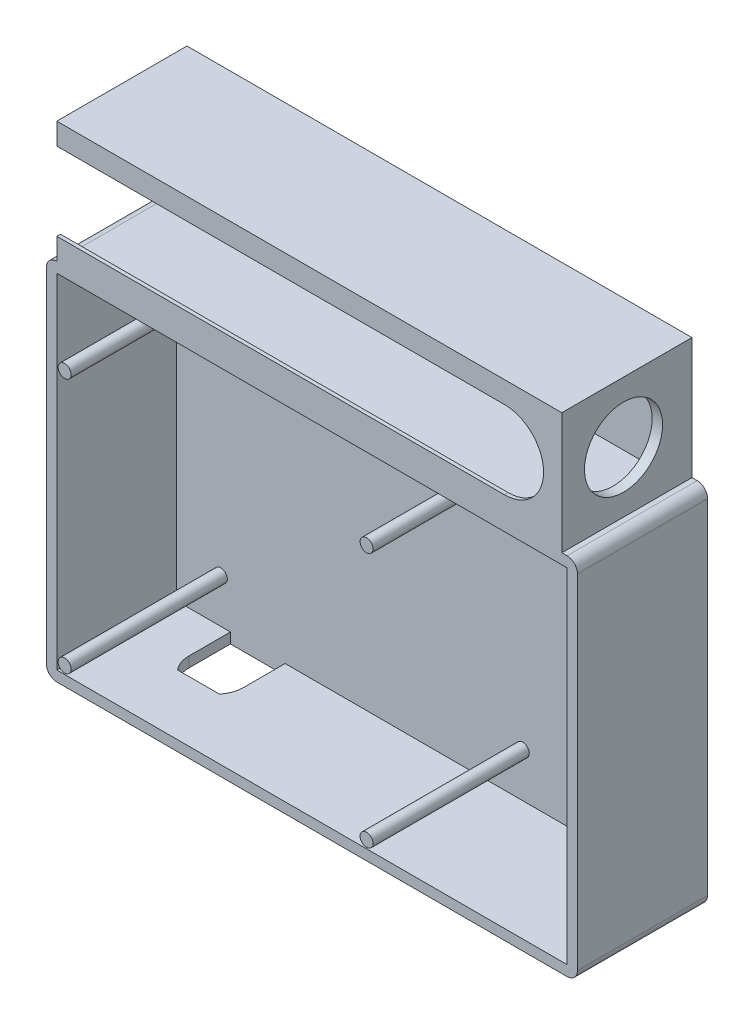
ISO-10303-21;
HEADER;
FILE_DESCRIPTION(('STEP AP214'),'2;1');
FILE_NAME('part.step','',(''),(''),'','','');
FILE_SCHEMA(('AUTOMOTIVE_DESIGN { 1 0 10303 214 1 1 1 1 }'));
ENDSEC;
DATA;
#1=APPLICATION_CONTEXT('core data for automotive mechanical design processes');
#2=APPLICATION_PROTOCOL_DEFINITION('international standard','automotive_design',2000,#1);
#3=PRODUCT_CONTEXT('',#1,'mechanical');
#4=PRODUCT('Part','Part','',(#3));
#5=PRODUCT_RELATED_PRODUCT_CATEGORY('part','',(#4));
#6=PRODUCT_DEFINITION_FORMATION('','',#4);
#7=PRODUCT_DEFINITION_CONTEXT('part definition',#1,'design');
#8=PRODUCT_DEFINITION('design','',#6,#7);
#9=PRODUCT_DEFINITION_SHAPE('','',#8);
#10=(LENGTH_UNIT() NAMED_UNIT(*) SI_UNIT(.MILLI.,.METRE.));
#11=(NAMED_UNIT(*) PLANE_ANGLE_UNIT() SI_UNIT($,.RADIAN.));
#12=(NAMED_UNIT(*) SI_UNIT($,.STERADIAN.) SOLID_ANGLE_UNIT());
#13=UNCERTAINTY_MEASURE_WITH_UNIT(LENGTH_MEASURE(1.E-05),#10,'distance_accuracy_value','');
#14=(GEOMETRIC_REPRESENTATION_CONTEXT(3) GLOBAL_UNCERTAINTY_ASSIGNED_CONTEXT((#13)) GLOBAL_UNIT_ASSIGNED_CONTEXT((#10,
#11,#12)) REPRESENTATION_CONTEXT('',''));
#15=CARTESIAN_POINT('',(0.,0.,0.));
#16=DIRECTION('',(0.,0.,1.));
#17=DIRECTION('',(1.,0.,0.));
#18=AXIS2_PLACEMENT_3D('',#15,#16,#17);
#19=CARTESIAN_POINT('',(-4.99999999999999,63.,25.));
#20=DIRECTION('',(0.,1.,0.));
#21=DIRECTION('',(0.,0.,1.));
#22=AXIS2_PLACEMENT_3D('',#19,#20,#21);
#23=PLANE('',#22);
#24=DIRECTION('',(0.,0.,-1.));
#25=VECTOR('',#24,1.);
#26=CARTESIAN_POINT('',(92.,63.,0.));
#27=LINE('',#26,#25);
#28=CARTESIAN_POINT('',(92.,63.,25.));
#29=VERTEX_POINT('',#28);
#30=CARTESIAN_POINT('',(92.,63.,0.));
#31=VERTEX_POINT('',#30);
#32=EDGE_CURVE('E58',#29,#31,#27,.T.);
#33=ORIENTED_EDGE('',*,*,#32,.F.);
#34=DIRECTION('',(1.,0.,0.));
#35=VECTOR('',#34,1.);
#36=CARTESIAN_POINT('',(-4.99999999999999,63.,25.));
#37=LINE('',#36,#35);
#38=CARTESIAN_POINT('',(93.,63.,25.));
#39=VERTEX_POINT('',#38);
#40=EDGE_CURVE('E373',#29,#39,#37,.T.);
#41=ORIENTED_EDGE('',*,*,#40,.T.);
#42=DIRECTION('',(0.,0.,-1.));
#43=VECTOR('',#42,1.);
#44=CARTESIAN_POINT('',(93.,63.,25.));
#45=LINE('',#44,#43);
#46=CARTESIAN_POINT('',(93.,63.,0.));
#47=VERTEX_POINT('',#46);
#48=EDGE_CURVE('E428',#39,#47,#45,.T.);
#49=ORIENTED_EDGE('',*,*,#48,.T.);
#50=DIRECTION('',(1.,0.,0.));
#51=VECTOR('',#50,1.);
#52=CARTESIAN_POINT('',(-4.99999999999999,63.,0.));
#53=LINE('',#52,#51);
#54=EDGE_CURVE('E396',#31,#47,#53,.T.);
#55=ORIENTED_EDGE('',*,*,#54,.F.);
#56=EDGE_LOOP('',(#33,#41,#49,#55));
#57=FACE_BOUND('',#56,.T.);
#58=ADVANCED_FACE('F35',(#57),#23,.T.);
#59=DIRECTION('',(0.,0.,-1.));
#60=VECTOR('',#59,1.);
#61=CARTESIAN_POINT('',(-4.99999999999999,63.,25.));
#62=LINE('',#61,#60);
#63=CARTESIAN_POINT('',(-4.99999999999999,63.,24.3));
#64=VERTEX_POINT('',#63);
#65=CARTESIAN_POINT('',(-5.,63.,2.));
#66=VERTEX_POINT('',#65);
#67=EDGE_CURVE('E50',#64,#66,#62,.T.);
#68=ORIENTED_EDGE('',*,*,#67,.F.);
#69=DIRECTION('',(-1.,0.,0.));
#70=VECTOR('',#69,1.);
#71=CARTESIAN_POINT('',(0.,63.,24.3));
#72=LINE('',#71,#70);
#73=CARTESIAN_POINT('',(90.,63.,24.3));
#74=VERTEX_POINT('',#73);
#75=EDGE_CURVE('E263',#74,#64,#72,.T.);
#76=ORIENTED_EDGE('',*,*,#75,.F.);
#77=DIRECTION('',(0.,0.,-1.));
#78=VECTOR('',#77,1.);
#79=CARTESIAN_POINT('',(90.,63.,0.));
#80=LINE('',#79,#78);
#81=CARTESIAN_POINT('',(90.,63.,2.));
#82=VERTEX_POINT('',#81);
#83=EDGE_CURVE('E281',#74,#82,#80,.T.);
#84=ORIENTED_EDGE('',*,*,#83,.T.);
#85=DIRECTION('',(-1.,0.,0.));
#86=VECTOR('',#85,1.);
#87=CARTESIAN_POINT('',(90.,63.,2.));
#88=LINE('',#87,#86);
#89=EDGE_CURVE('E311',#82,#66,#88,.T.);
#90=ORIENTED_EDGE('',*,*,#89,.T.);
#91=EDGE_LOOP('',(#68,#76,#84,#90));
#92=FACE_BOUND('',#91,.T.);
#93=ADVANCED_FACE('F522',(#92),#23,.T.);
#94=CARTESIAN_POINT('',(-4.99999999999999,-7.,25.));
#95=DIRECTION('',(0.,-1.,0.));
#96=DIRECTION('',(0.,0.,-1.));
#97=AXIS2_PLACEMENT_3D('',#94,#95,#96);
#98=PLANE('',#97);
#99=DIRECTION('',(-1.,0.,0.));
#100=VECTOR('',#99,1.);
#101=CARTESIAN_POINT('',(-4.99999999999999,-7.,0.));
#102=LINE('',#101,#100);
#103=CARTESIAN_POINT('',(93.,-7.,0.));
#104=VERTEX_POINT('',#103);
#105=CARTESIAN_POINT('',(-4.99999999999999,-7.,0.));
#106=VERTEX_POINT('',#105);
#107=EDGE_CURVE('E407',#104,#106,#102,.T.);
#108=ORIENTED_EDGE('',*,*,#107,.F.);
#109=DIRECTION('',(0.,0.,-1.));
#110=VECTOR('',#109,1.);
#111=CARTESIAN_POINT('',(93.,-7.,25.));
#112=LINE('',#111,#110);
#113=CARTESIAN_POINT('',(93.,-7.,25.));
#114=VERTEX_POINT('',#113);
#115=EDGE_CURVE('E422',#114,#104,#112,.T.);
#116=ORIENTED_EDGE('',*,*,#115,.F.);
#117=DIRECTION('',(-1.,0.,0.));
#118=VECTOR('',#117,1.);
#119=CARTESIAN_POINT('',(-4.99999999999999,-7.,25.));
#120=LINE('',#119,#118);
#121=CARTESIAN_POINT('',(-4.99999999999999,-7.,25.));
#122=VERTEX_POINT('',#121);
#123=EDGE_CURVE('E385',#114,#122,#120,.T.);
#124=ORIENTED_EDGE('',*,*,#123,.T.);
#125=DIRECTION('',(0.,0.,-1.));
#126=VECTOR('',#125,1.);
#127=CARTESIAN_POINT('',(-4.99999999999999,-7.,25.));
#128=LINE('',#127,#126);
#129=EDGE_CURVE('E420',#122,#106,#128,.T.);
#130=ORIENTED_EDGE('',*,*,#129,.T.);
#131=EDGE_LOOP('',(#108,#116,#124,#130));
#132=FACE_BOUND('',#131,.T.);
#133=CARTESIAN_POINT('',(10.6,-7.,10.));
#134=DIRECTION('',(0.,-1.,0.));
#135=DIRECTION('',(0.,0.,-1.));
#136=AXIS2_PLACEMENT_3D('',#133,#134,#135);
#137=CIRCLE('',#136,5.25);
#138=CARTESIAN_POINT('',(15.85,-7.,10.));
#139=VERTEX_POINT('',#138);
#140=CARTESIAN_POINT('',(14.6003124877939,-7.,13.4));
#141=VERTEX_POINT('',#140);
#142=EDGE_CURVE('E318',#139,#141,#137,.T.);
#143=ORIENTED_EDGE('',*,*,#142,.F.);
#144=DIRECTION('',(0.,0.,-1.));
#145=VECTOR('',#144,1.);
#146=CARTESIAN_POINT('',(15.85,-7.,0.));
#147=LINE('',#146,#145);
#148=CARTESIAN_POINT('',(15.85,-7.,2.));
#149=VERTEX_POINT('',#148);
#150=EDGE_CURVE('E315',#139,#149,#147,.T.);
#151=ORIENTED_EDGE('',*,*,#150,.T.);
#152=DIRECTION('',(-1.,0.,0.));
#153=VECTOR('',#152,1.);
#154=CARTESIAN_POINT('',(0.,-7.,2.));
#155=LINE('',#154,#153);
#156=CARTESIAN_POINT('',(5.35,-7.,2.));
#157=VERTEX_POINT('',#156);
#158=EDGE_CURVE('E330',#149,#157,#155,.T.);
#159=ORIENTED_EDGE('',*,*,#158,.T.);
#160=DIRECTION('',(0.,0.,-1.));
#161=VECTOR('',#160,1.);
#162=CARTESIAN_POINT('',(5.35,-7.,0.));
#163=LINE('',#162,#161);
#164=CARTESIAN_POINT('',(5.35,-7.,10.));
#165=VERTEX_POINT('',#164);
#166=EDGE_CURVE('E327',#165,#157,#163,.T.);
#167=ORIENTED_EDGE('',*,*,#166,.F.);
#168=CARTESIAN_POINT('',(10.6,-7.,10.));
#169=DIRECTION('',(0.,-1.,0.));
#170=DIRECTION('',(0.,0.,-1.));
#171=AXIS2_PLACEMENT_3D('',#168,#169,#170);
#172=CIRCLE('',#171,5.25);
#173=CARTESIAN_POINT('',(6.59968751220608,-7.,13.4));
#174=VERTEX_POINT('',#173);
#175=EDGE_CURVE('E324',#174,#165,#172,.T.);
#176=ORIENTED_EDGE('',*,*,#175,.F.);
#177=DIRECTION('',(1.,0.,0.));
#178=VECTOR('',#177,1.);
#179=CARTESIAN_POINT('',(0.,-7.,13.4));
#180=LINE('',#179,#178);
#181=EDGE_CURVE('E321',#174,#141,#180,.T.);
#182=ORIENTED_EDGE('',*,*,#181,.T.);
#183=EDGE_LOOP('',(#143,#151,#159,#167,#176,#182));
#184=FACE_BOUND('',#183,.T.);
#185=ADVANCED_FACE('F520',(#132,#184),#98,.T.);
#186=CARTESIAN_POINT('',(-5.,-5.,25.));
#187=DIRECTION('',(0.,-1.,0.));
#188=DIRECTION('',(0.,0.,-1.));
#189=AXIS2_PLACEMENT_3D('',#186,#187,#188);
#190=PLANE('',#189);
#191=DIRECTION('',(0.,0.,-1.));
#192=VECTOR('',#191,1.);
#193=CARTESIAN_POINT('',(15.85,-5.,25.));
#194=LINE('',#193,#192);
#195=CARTESIAN_POINT('',(15.85,-5.,10.));
#196=VERTEX_POINT('',#195);
#197=CARTESIAN_POINT('',(15.85,-5.,2.));
#198=VERTEX_POINT('',#197);
#199=EDGE_CURVE('E11',#196,#198,#194,.T.);
#200=ORIENTED_EDGE('',*,*,#199,.F.);
#201=CARTESIAN_POINT('',(10.6,-5.,10.));
#202=DIRECTION('',(0.,-1.,0.));
#203=DIRECTION('',(0.,0.,-1.));
#204=AXIS2_PLACEMENT_3D('',#201,#202,#203);
#205=CIRCLE('',#204,5.25);
#206=CARTESIAN_POINT('',(14.6003124877939,-5.,13.4));
#207=VERTEX_POINT('',#206);
#208=EDGE_CURVE('E468',#196,#207,#205,.T.);
#209=ORIENTED_EDGE('',*,*,#208,.T.);
#210=DIRECTION('',(1.,0.,0.));
#211=VECTOR('',#210,1.);
#212=CARTESIAN_POINT('',(-5.,-5.,13.4));
#213=LINE('',#212,#211);
#214=CARTESIAN_POINT('',(6.59968751220608,-5.,13.4));
#215=VERTEX_POINT('',#214);
#216=EDGE_CURVE('E471',#215,#207,#213,.T.);
#217=ORIENTED_EDGE('',*,*,#216,.F.);
#218=CARTESIAN_POINT('',(10.6,-5.,10.));
#219=DIRECTION('',(0.,-1.,0.));
#220=DIRECTION('',(0.,0.,-1.));
#221=AXIS2_PLACEMENT_3D('',#218,#219,#220);
#222=CIRCLE('',#221,5.25);
#223=CARTESIAN_POINT('',(5.35,-5.,10.));
#224=VERTEX_POINT('',#223);
#225=EDGE_CURVE('E474',#215,#224,#222,.T.);
#226=ORIENTED_EDGE('',*,*,#225,.T.);
#227=DIRECTION('',(0.,0.,-1.));
#228=VECTOR('',#227,1.);
#229=CARTESIAN_POINT('',(5.35,-5.,25.));
#230=LINE('',#229,#228);
#231=CARTESIAN_POINT('',(5.35,-5.,2.));
#232=VERTEX_POINT('',#231);
#233=EDGE_CURVE('E43',#224,#232,#230,.T.);
#234=ORIENTED_EDGE('',*,*,#233,.T.);
#235=DIRECTION('',(1.,0.,0.));
#236=VECTOR('',#235,1.);
#237=CARTESIAN_POINT('',(0.,-5.,2.));
#238=LINE('',#237,#236);
#239=CARTESIAN_POINT('',(-5.,-5.,2.));
#240=VERTEX_POINT('',#239);
#241=EDGE_CURVE('E453',#240,#232,#238,.T.);
#242=ORIENTED_EDGE('',*,*,#241,.F.);
#243=DIRECTION('',(0.,0.,-1.));
#244=VECTOR('',#243,1.);
#245=CARTESIAN_POINT('',(-5.,-5.,25.));
#246=LINE('',#245,#244);
#247=CARTESIAN_POINT('',(-5.,-5.,25.));
#248=VERTEX_POINT('',#247);
#249=EDGE_CURVE('E359',#248,#240,#246,.T.);
#250=ORIENTED_EDGE('',*,*,#249,.F.);
#251=DIRECTION('',(-1.,0.,0.));
#252=VECTOR('',#251,1.);
#253=CARTESIAN_POINT('',(-5.,-5.,25.));
#254=LINE('',#253,#252);
#255=CARTESIAN_POINT('',(93.,-5.,25.));
#256=VERTEX_POINT('',#255);
#257=EDGE_CURVE('E355',#256,#248,#254,.T.);
#258=ORIENTED_EDGE('',*,*,#257,.F.);
#259=DIRECTION('',(0.,0.,-1.));
#260=VECTOR('',#259,1.);
#261=CARTESIAN_POINT('',(93.,-5.,25.));
#262=LINE('',#261,#260);
#263=CARTESIAN_POINT('',(93.,-5.,2.));
#264=VERTEX_POINT('',#263);
#265=EDGE_CURVE('E363',#256,#264,#262,.T.);
#266=ORIENTED_EDGE('',*,*,#265,.T.);
#267=EDGE_CURVE('E452',#198,#264,#238,.T.);
#268=ORIENTED_EDGE('',*,*,#267,.F.);
#269=EDGE_LOOP('',(#200,#209,#217,#226,#234,#242,#250,#258,#266,#268));
#270=FACE_BOUND('',#269,.T.);
#271=ADVANCED_FACE('F480',(#270),#190,.F.);
#272=CARTESIAN_POINT('',(0.,0.,2.));
#273=DIRECTION('',(0.,0.,1.));
#274=DIRECTION('',(1.,0.,0.));
#275=AXIS2_PLACEMENT_3D('',#272,#273,#274);
#276=PLANE('',#275);
#277=DIRECTION('',(0.,-1.,0.));
#278=VECTOR('',#277,1.);
#279=CARTESIAN_POINT('',(15.85,18.,2.));
#280=LINE('',#279,#278);
#281=EDGE_CURVE('E334',#198,#149,#280,.T.);
#282=ORIENTED_EDGE('',*,*,#281,.F.);
#283=ORIENTED_EDGE('',*,*,#267,.T.);
#284=DIRECTION('',(0.,1.,0.));
#285=VECTOR('',#284,1.);
#286=CARTESIAN_POINT('',(93.,0.,2.));
#287=LINE('',#286,#285);
#288=CARTESIAN_POINT('',(93.,61.,2.));
#289=VERTEX_POINT('',#288);
#290=EDGE_CURVE('E444',#264,#289,#287,.T.);
#291=ORIENTED_EDGE('',*,*,#290,.T.);
#292=DIRECTION('',(1.,0.,0.));
#293=VECTOR('',#292,1.);
#294=CARTESIAN_POINT('',(0.,61.,2.));
#295=LINE('',#294,#293);
#296=CARTESIAN_POINT('',(-5.,61.,2.));
#297=VERTEX_POINT('',#296);
#298=EDGE_CURVE('E446',#297,#289,#295,.T.);
#299=ORIENTED_EDGE('',*,*,#298,.F.);
#300=DIRECTION('',(0.,1.,0.));
#301=VECTOR('',#300,1.);
#302=CARTESIAN_POINT('',(-5.,0.,2.));
#303=LINE('',#302,#301);
#304=EDGE_CURVE('E449',#240,#297,#303,.T.);
#305=ORIENTED_EDGE('',*,*,#304,.F.);
#306=ORIENTED_EDGE('',*,*,#241,.T.);
#307=DIRECTION('',(0.,-1.,0.));
#308=VECTOR('',#307,1.);
#309=CARTESIAN_POINT('',(5.35,18.,2.));
#310=LINE('',#309,#308);
#311=EDGE_CURVE('E337',#232,#157,#310,.T.);
#312=ORIENTED_EDGE('',*,*,#311,.T.);
#313=ORIENTED_EDGE('',*,*,#158,.F.);
#314=EDGE_LOOP('',(#282,#283,#291,#299,#305,#306,#312,#313));
#315=FACE_BOUND('',#314,.T.);
#316=CARTESIAN_POINT('',(3.5,52.5,2.));
#317=DIRECTION('',(0.,0.,1.));
#318=DIRECTION('',(1.,0.,0.));
#319=AXIS2_PLACEMENT_3D('',#316,#317,#318);
#320=CIRCLE('',#319,1.25);
#321=CARTESIAN_POINT('',(4.75,52.5,2.));
#322=VERTEX_POINT('',#321);
#323=EDGE_CURVE('E456',#322,#322,#320,.T.);
#324=ORIENTED_EDGE('',*,*,#323,.F.);
#325=EDGE_LOOP('',(#324));
#326=FACE_BOUND('',#325,.T.);
#327=CARTESIAN_POINT('',(3.50000000000051,3.5,2.));
#328=DIRECTION('',(0.,0.,1.));
#329=DIRECTION('',(1.,0.,0.));
#330=AXIS2_PLACEMENT_3D('',#327,#328,#329);
#331=CIRCLE('',#330,1.25);
#332=CARTESIAN_POINT('',(4.75000000000051,3.5,2.));
#333=VERTEX_POINT('',#332);
#334=EDGE_CURVE('E459',#333,#333,#331,.T.);
#335=ORIENTED_EDGE('',*,*,#334,.F.);
#336=EDGE_LOOP('',(#335));
#337=FACE_BOUND('',#336,.T.);
#338=CARTESIAN_POINT('',(61.5000000000005,3.5,2.));
#339=DIRECTION('',(0.,0.,1.));
#340=DIRECTION('',(1.,0.,0.));
#341=AXIS2_PLACEMENT_3D('',#338,#339,#340);
#342=CIRCLE('',#341,1.25);
#343=CARTESIAN_POINT('',(62.7500000000005,3.5,2.));
#344=VERTEX_POINT('',#343);
#345=EDGE_CURVE('E462',#344,#344,#342,.T.);
#346=ORIENTED_EDGE('',*,*,#345,.F.);
#347=EDGE_LOOP('',(#346));
#348=FACE_BOUND('',#347,.T.);
#349=CARTESIAN_POINT('',(61.5,52.5,2.));
#350=DIRECTION('',(0.,0.,1.));
#351=DIRECTION('',(1.,0.,0.));
#352=AXIS2_PLACEMENT_3D('',#349,#350,#351);
#353=CIRCLE('',#352,1.25);
#354=CARTESIAN_POINT('',(62.75,52.5,2.));
#355=VERTEX_POINT('',#354);
#356=EDGE_CURVE('E465',#355,#355,#353,.T.);
#357=ORIENTED_EDGE('',*,*,#356,.F.);
#358=EDGE_LOOP('',(#357));
#359=FACE_BOUND('',#358,.T.);
#360=ADVANCED_FACE('F486',(#315,#326,#337,#348,#359),#276,.T.);
#361=CARTESIAN_POINT('',(3.5,52.5,32.));
#362=DIRECTION('',(0.,0.,-1.));
#363=DIRECTION('',(-1.,0.,0.));
#364=AXIS2_PLACEMENT_3D('',#361,#362,#363);
#365=CYLINDRICAL_SURFACE('',#364,1.25);
#366=ORIENTED_EDGE('',*,*,#323,.T.);
#367=EDGE_LOOP('',(#366));
#368=FACE_BOUND('',#367,.T.);
#369=CARTESIAN_POINT('',(3.5,52.5,32.));
#370=DIRECTION('',(0.,0.,1.));
#371=DIRECTION('',(1.,0.,0.));
#372=AXIS2_PLACEMENT_3D('',#369,#370,#371);
#373=CIRCLE('',#372,1.25);
#374=CARTESIAN_POINT('',(4.75,52.5,32.));
#375=VERTEX_POINT('',#374);
#376=EDGE_CURVE('E441',#375,#375,#373,.T.);
#377=ORIENTED_EDGE('',*,*,#376,.F.);
#378=EDGE_LOOP('',(#377));
#379=FACE_BOUND('',#378,.T.);
#380=ADVANCED_FACE('F573',(#368,#379),#365,.T.);
#381=CARTESIAN_POINT('',(0.,0.,32.));
#382=DIRECTION('',(0.,0.,1.));
#383=DIRECTION('',(1.,0.,0.));
#384=AXIS2_PLACEMENT_3D('',#381,#382,#383);
#385=PLANE('',#384);
#386=ORIENTED_EDGE('',*,*,#376,.T.);
#387=EDGE_LOOP('',(#386));
#388=FACE_BOUND('',#387,.T.);
#389=ADVANCED_FACE('F569',(#388),#385,.T.);
#390=CARTESIAN_POINT('',(3.50000000000051,3.5,32.));
#391=DIRECTION('',(0.,0.,-1.));
#392=DIRECTION('',(-1.,0.,0.));
#393=AXIS2_PLACEMENT_3D('',#390,#391,#392);
#394=CYLINDRICAL_SURFACE('',#393,1.25);
#395=ORIENTED_EDGE('',*,*,#334,.T.);
#396=EDGE_LOOP('',(#395));
#397=FACE_BOUND('',#396,.T.);
#398=CARTESIAN_POINT('',(3.50000000000051,3.5,32.));
#399=DIRECTION('',(0.,0.,1.));
#400=DIRECTION('',(1.,0.,0.));
#401=AXIS2_PLACEMENT_3D('',#398,#399,#400);
#402=CIRCLE('',#401,1.25);
#403=CARTESIAN_POINT('',(4.75000000000051,3.5,32.));
#404=VERTEX_POINT('',#403);
#405=EDGE_CURVE('E438',#404,#404,#402,.T.);
#406=ORIENTED_EDGE('',*,*,#405,.F.);
#407=EDGE_LOOP('',(#406));
#408=FACE_BOUND('',#407,.T.);
#409=ADVANCED_FACE('F565',(#397,#408),#394,.T.);
#410=CARTESIAN_POINT('',(0.,0.,32.));
#411=DIRECTION('',(0.,0.,1.));
#412=DIRECTION('',(1.,0.,0.));
#413=AXIS2_PLACEMENT_3D('',#410,#411,#412);
#414=PLANE('',#413);
#415=ORIENTED_EDGE('',*,*,#405,.T.);
#416=EDGE_LOOP('',(#415));
#417=FACE_BOUND('',#416,.T.);
#418=ADVANCED_FACE('F561',(#417),#414,.T.);
#419=CARTESIAN_POINT('',(61.5000000000005,3.5,32.));
#420=DIRECTION('',(0.,0.,-1.));
#421=DIRECTION('',(-1.,0.,0.));
#422=AXIS2_PLACEMENT_3D('',#419,#420,#421);
#423=CYLINDRICAL_SURFACE('',#422,1.25);
#424=ORIENTED_EDGE('',*,*,#345,.T.);
#425=EDGE_LOOP('',(#424));
#426=FACE_BOUND('',#425,.T.);
#427=CARTESIAN_POINT('',(61.5000000000005,3.5,32.));
#428=DIRECTION('',(0.,0.,1.));
#429=DIRECTION('',(1.,0.,0.));
#430=AXIS2_PLACEMENT_3D('',#427,#428,#429);
#431=CIRCLE('',#430,1.25);
#432=CARTESIAN_POINT('',(62.7500000000005,3.5,32.));
#433=VERTEX_POINT('',#432);
#434=EDGE_CURVE('E435',#433,#433,#431,.T.);
#435=ORIENTED_EDGE('',*,*,#434,.F.);
#436=EDGE_LOOP('',(#435));
#437=FACE_BOUND('',#436,.T.);
#438=ADVANCED_FACE('F557',(#426,#437),#423,.T.);
#439=CARTESIAN_POINT('',(0.,0.,32.));
#440=DIRECTION('',(0.,0.,1.));
#441=DIRECTION('',(1.,0.,0.));
#442=AXIS2_PLACEMENT_3D('',#439,#440,#441);
#443=PLANE('',#442);
#444=ORIENTED_EDGE('',*,*,#434,.T.);
#445=EDGE_LOOP('',(#444));
#446=FACE_BOUND('',#445,.T.);
#447=ADVANCED_FACE('F553',(#446),#443,.T.);
#448=CARTESIAN_POINT('',(61.5,52.5,32.));
#449=DIRECTION('',(0.,0.,-1.));
#450=DIRECTION('',(-1.,0.,0.));
#451=AXIS2_PLACEMENT_3D('',#448,#449,#450);
#452=CYLINDRICAL_SURFACE('',#451,1.25);
#453=ORIENTED_EDGE('',*,*,#356,.T.);
#454=EDGE_LOOP('',(#453));
#455=FACE_BOUND('',#454,.T.);
#456=CARTESIAN_POINT('',(61.5,52.5,32.));
#457=DIRECTION('',(0.,0.,1.));
#458=DIRECTION('',(1.,0.,0.));
#459=AXIS2_PLACEMENT_3D('',#456,#457,#458);
#460=CIRCLE('',#459,1.25);
#461=CARTESIAN_POINT('',(62.75,52.5,32.));
#462=VERTEX_POINT('',#461);
#463=EDGE_CURVE('E417',#462,#462,#460,.T.);
#464=ORIENTED_EDGE('',*,*,#463,.F.);
#465=EDGE_LOOP('',(#464));
#466=FACE_BOUND('',#465,.T.);
#467=ADVANCED_FACE('F549',(#455,#466),#452,.T.);
#468=CARTESIAN_POINT('',(0.,0.,32.));
#469=DIRECTION('',(0.,0.,1.));
#470=DIRECTION('',(1.,0.,0.));
#471=AXIS2_PLACEMENT_3D('',#468,#469,#470);
#472=PLANE('',#471);
#473=ORIENTED_EDGE('',*,*,#463,.T.);
#474=EDGE_LOOP('',(#473));
#475=FACE_BOUND('',#474,.T.);
#476=ADVANCED_FACE('F545',(#475),#472,.T.);
#477=CARTESIAN_POINT('',(-5.,61.,25.));
#478=DIRECTION('',(0.,0.,-1.));
#479=DIRECTION('',(-1.,0.,0.));
#480=AXIS2_PLACEMENT_3D('',#477,#478,#479);
#481=CYLINDRICAL_SURFACE('',#480,2.);
#482=CARTESIAN_POINT('',(-5.,61.,0.));
#483=DIRECTION('',(0.,0.,-1.));
#484=DIRECTION('',(-1.,0.,0.));
#485=AXIS2_PLACEMENT_3D('',#482,#483,#484);
#486=CIRCLE('',#485,2.);
#487=CARTESIAN_POINT('',(-7.,61.,0.));
#488=VERTEX_POINT('',#487);
#489=CARTESIAN_POINT('',(-5.,63.,0.));
#490=VERTEX_POINT('',#489);
#491=EDGE_CURVE('E362',#488,#490,#486,.T.);
#492=ORIENTED_EDGE('',*,*,#491,.F.);
#493=DIRECTION('',(0.,0.,-1.));
#494=VECTOR('',#493,1.);
#495=CARTESIAN_POINT('',(-7.,61.,25.));
#496=LINE('',#495,#494);
#497=CARTESIAN_POINT('',(-7.,61.,25.));
#498=VERTEX_POINT('',#497);
#499=EDGE_CURVE('E415',#498,#488,#496,.T.);
#500=ORIENTED_EDGE('',*,*,#499,.F.);
#501=CARTESIAN_POINT('',(-5.,61.,25.));
#502=DIRECTION('',(0.,0.,-1.));
#503=DIRECTION('',(-1.,0.,0.));
#504=AXIS2_PLACEMENT_3D('',#501,#502,#503);
#505=CIRCLE('',#504,2.);
#506=CARTESIAN_POINT('',(-4.99999999999999,63.,25.));
#507=VERTEX_POINT('',#506);
#508=EDGE_CURVE('E371',#498,#507,#505,.T.);
#509=ORIENTED_EDGE('',*,*,#508,.T.);
#510=EDGE_CURVE('E431',#507,#64,#62,.T.);
#511=ORIENTED_EDGE('',*,*,#510,.T.);
#512=ORIENTED_EDGE('',*,*,#67,.T.);
#513=DIRECTION('',(0.,0.,1.));
#514=VECTOR('',#513,1.);
#515=CARTESIAN_POINT('',(-5.,63.,0.));
#516=LINE('',#515,#514);
#517=EDGE_CURVE('E303',#490,#66,#516,.T.);
#518=ORIENTED_EDGE('',*,*,#517,.F.);
#519=EDGE_LOOP('',(#492,#500,#509,#511,#512,#518));
#520=FACE_BOUND('',#519,.T.);
#521=ADVANCED_FACE('F541',(#520),#481,.T.);
#522=CARTESIAN_POINT('',(-7.,-4.99999999999999,25.));
#523=DIRECTION('',(-1.,0.,0.));
#524=DIRECTION('',(0.,0.,1.));
#525=AXIS2_PLACEMENT_3D('',#522,#523,#524);
#526=PLANE('',#525);
#527=DIRECTION('',(0.,1.,0.));
#528=VECTOR('',#527,1.);
#529=CARTESIAN_POINT('',(-7.,-4.99999999999999,0.));
#530=LINE('',#529,#528);
#531=CARTESIAN_POINT('',(-7.,-4.99999999999999,0.));
#532=VERTEX_POINT('',#531);
#533=EDGE_CURVE('E374',#532,#488,#530,.T.);
#534=ORIENTED_EDGE('',*,*,#533,.F.);
#535=DIRECTION('',(0.,0.,-1.));
#536=VECTOR('',#535,1.);
#537=CARTESIAN_POINT('',(-7.,-4.99999999999999,25.));
#538=LINE('',#537,#536);
#539=CARTESIAN_POINT('',(-7.,-4.99999999999999,25.));
#540=VERTEX_POINT('',#539);
#541=EDGE_CURVE('E418',#540,#532,#538,.T.);
#542=ORIENTED_EDGE('',*,*,#541,.F.);
#543=DIRECTION('',(0.,1.,0.));
#544=VECTOR('',#543,1.);
#545=CARTESIAN_POINT('',(-7.,-4.99999999999999,25.));
#546=LINE('',#545,#544);
#547=EDGE_CURVE('E391',#540,#498,#546,.T.);
#548=ORIENTED_EDGE('',*,*,#547,.T.);
#549=ORIENTED_EDGE('',*,*,#499,.T.);
#550=EDGE_LOOP('',(#534,#542,#548,#549));
#551=FACE_BOUND('',#550,.T.);
#552=ADVANCED_FACE('F544',(#551),#526,.T.);
#553=CARTESIAN_POINT('',(-5.,-5.,25.));
#554=DIRECTION('',(0.,0.,-1.));
#555=DIRECTION('',(-1.,0.,0.));
#556=AXIS2_PLACEMENT_3D('',#553,#554,#555);
#557=CYLINDRICAL_SURFACE('',#556,2.);
#558=CARTESIAN_POINT('',(-5.,-5.,0.));
#559=DIRECTION('',(0.,0.,-1.));
#560=DIRECTION('',(1.,0.,0.));
#561=AXIS2_PLACEMENT_3D('',#558,#559,#560);
#562=CIRCLE('',#561,2.);
#563=EDGE_CURVE('E410',#106,#532,#562,.T.);
#564=ORIENTED_EDGE('',*,*,#563,.F.);
#565=ORIENTED_EDGE('',*,*,#129,.F.);
#566=CARTESIAN_POINT('',(-5.,-5.,25.));
#567=DIRECTION('',(0.,0.,-1.));
#568=DIRECTION('',(1.,0.,0.));
#569=AXIS2_PLACEMENT_3D('',#566,#567,#568);
#570=CIRCLE('',#569,2.);
#571=EDGE_CURVE('E388',#122,#540,#570,.T.);
#572=ORIENTED_EDGE('',*,*,#571,.T.);
#573=ORIENTED_EDGE('',*,*,#541,.T.);
#574=EDGE_LOOP('',(#564,#565,#572,#573));
#575=FACE_BOUND('',#574,.T.);
#576=ADVANCED_FACE('F627',(#575),#557,.T.);
#577=CARTESIAN_POINT('',(93.,-5.,25.));
#578=DIRECTION('',(0.,0.,-1.));
#579=DIRECTION('',(-1.,0.,0.));
#580=AXIS2_PLACEMENT_3D('',#577,#578,#579);
#581=CYLINDRICAL_SURFACE('',#580,2.);
#582=CARTESIAN_POINT('',(93.,-5.,0.));
#583=DIRECTION('',(0.,0.,-1.));
#584=DIRECTION('',(-1.,0.,0.));
#585=AXIS2_PLACEMENT_3D('',#582,#583,#584);
#586=CIRCLE('',#585,2.);
#587=CARTESIAN_POINT('',(95.,-4.99999999999999,0.));
#588=VERTEX_POINT('',#587);
#589=EDGE_CURVE('E404',#588,#104,#586,.T.);
#590=ORIENTED_EDGE('',*,*,#589,.F.);
#591=DIRECTION('',(0.,0.,-1.));
#592=VECTOR('',#591,1.);
#593=CARTESIAN_POINT('',(95.,-4.99999999999999,25.));
#594=LINE('',#593,#592);
#595=CARTESIAN_POINT('',(95.,-4.99999999999999,25.));
#596=VERTEX_POINT('',#595);
#597=EDGE_CURVE('E424',#596,#588,#594,.T.);
#598=ORIENTED_EDGE('',*,*,#597,.F.);
#599=CARTESIAN_POINT('',(93.,-5.,25.));
#600=DIRECTION('',(0.,0.,-1.));
#601=DIRECTION('',(-1.,0.,0.));
#602=AXIS2_PLACEMENT_3D('',#599,#600,#601);
#603=CIRCLE('',#602,2.);
#604=EDGE_CURVE('E382',#596,#114,#603,.T.);
#605=ORIENTED_EDGE('',*,*,#604,.T.);
#606=ORIENTED_EDGE('',*,*,#115,.T.);
#607=EDGE_LOOP('',(#590,#598,#605,#606));
#608=FACE_BOUND('',#607,.T.);
#609=ADVANCED_FACE('F635',(#608),#581,.T.);
#610=CARTESIAN_POINT('',(95.,-4.99999999999999,25.));
#611=DIRECTION('',(1.,0.,0.));
#612=DIRECTION('',(0.,0.,-1.));
#613=AXIS2_PLACEMENT_3D('',#610,#611,#612);
#614=PLANE('',#613);
#615=DIRECTION('',(0.,-1.,0.));
#616=VECTOR('',#615,1.);
#617=CARTESIAN_POINT('',(95.,-4.99999999999999,0.));
#618=LINE('',#617,#616);
#619=CARTESIAN_POINT('',(95.,61.,0.));
#620=VERTEX_POINT('',#619);
#621=EDGE_CURVE('E401',#620,#588,#618,.T.);
#622=ORIENTED_EDGE('',*,*,#621,.F.);
#623=DIRECTION('',(0.,0.,-1.));
#624=VECTOR('',#623,1.);
#625=CARTESIAN_POINT('',(95.,61.,25.));
#626=LINE('',#625,#624);
#627=CARTESIAN_POINT('',(95.,61.,25.));
#628=VERTEX_POINT('',#627);
#629=EDGE_CURVE('E426',#628,#620,#626,.T.);
#630=ORIENTED_EDGE('',*,*,#629,.F.);
#631=DIRECTION('',(0.,-1.,0.));
#632=VECTOR('',#631,1.);
#633=CARTESIAN_POINT('',(95.,-4.99999999999999,25.));
#634=LINE('',#633,#632);
#635=EDGE_CURVE('E379',#628,#596,#634,.T.);
#636=ORIENTED_EDGE('',*,*,#635,.T.);
#637=ORIENTED_EDGE('',*,*,#597,.T.);
#638=EDGE_LOOP('',(#622,#630,#636,#637));
#639=FACE_BOUND('',#638,.T.);
#640=ADVANCED_FACE('F642',(#639),#614,.T.);
#641=CARTESIAN_POINT('',(93.,61.,25.));
#642=DIRECTION('',(0.,0.,-1.));
#643=DIRECTION('',(-1.,0.,0.));
#644=AXIS2_PLACEMENT_3D('',#641,#642,#643);
#645=CYLINDRICAL_SURFACE('',#644,2.);
#646=CARTESIAN_POINT('',(93.,61.,0.));
#647=DIRECTION('',(0.,0.,-1.));
#648=DIRECTION('',(-1.,0.,0.));
#649=AXIS2_PLACEMENT_3D('',#646,#647,#648);
#650=CIRCLE('',#649,2.);
#651=EDGE_CURVE('E398',#47,#620,#650,.T.);
#652=ORIENTED_EDGE('',*,*,#651,.F.);
#653=ORIENTED_EDGE('',*,*,#48,.F.);
#654=CARTESIAN_POINT('',(93.,61.,25.));
#655=DIRECTION('',(0.,0.,-1.));
#656=DIRECTION('',(-1.,0.,0.));
#657=AXIS2_PLACEMENT_3D('',#654,#655,#656);
#658=CIRCLE('',#657,2.);
#659=EDGE_CURVE('E376',#39,#628,#658,.T.);
#660=ORIENTED_EDGE('',*,*,#659,.T.);
#661=ORIENTED_EDGE('',*,*,#629,.T.);
#662=EDGE_LOOP('',(#652,#653,#660,#661));
#663=FACE_BOUND('',#662,.T.);
#664=ADVANCED_FACE('F539',(#663),#645,.T.);
#665=CARTESIAN_POINT('',(-5.,61.,25.));
#666=DIRECTION('',(0.,0.,-1.));
#667=DIRECTION('',(-1.,0.,0.));
#668=AXIS2_PLACEMENT_3D('',#665,#666,#667);
#669=PLANE('',#668);
#670=ORIENTED_EDGE('',*,*,#257,.T.);
#671=DIRECTION('',(0.,1.,0.));
#672=VECTOR('',#671,1.);
#673=CARTESIAN_POINT('',(-5.,-5.,25.));
#674=LINE('',#673,#672);
#675=CARTESIAN_POINT('',(-5.,61.,25.));
#676=VERTEX_POINT('',#675);
#677=EDGE_CURVE('E336',#248,#676,#674,.T.);
#678=ORIENTED_EDGE('',*,*,#677,.T.);
#679=DIRECTION('',(1.,0.,0.));
#680=VECTOR('',#679,1.);
#681=CARTESIAN_POINT('',(-5.,61.,25.));
#682=LINE('',#681,#680);
#683=CARTESIAN_POINT('',(93.,61.,25.));
#684=VERTEX_POINT('',#683);
#685=EDGE_CURVE('E349',#676,#684,#682,.T.);
#686=ORIENTED_EDGE('',*,*,#685,.T.);
#687=DIRECTION('',(0.,-1.,0.));
#688=VECTOR('',#687,1.);
#689=CARTESIAN_POINT('',(93.,-5.,25.));
#690=LINE('',#689,#688);
#691=EDGE_CURVE('E352',#684,#256,#690,.T.);
#692=ORIENTED_EDGE('',*,*,#691,.T.);
#693=EDGE_LOOP('',(#670,#678,#686,#692));
#694=FACE_BOUND('',#693,.T.);
#695=ORIENTED_EDGE('',*,*,#508,.F.);
#696=ORIENTED_EDGE('',*,*,#547,.F.);
#697=ORIENTED_EDGE('',*,*,#571,.F.);
#698=ORIENTED_EDGE('',*,*,#123,.F.);
#699=ORIENTED_EDGE('',*,*,#604,.F.);
#700=ORIENTED_EDGE('',*,*,#635,.F.);
#701=ORIENTED_EDGE('',*,*,#659,.F.);
#702=ORIENTED_EDGE('',*,*,#40,.F.);
#703=DIRECTION('',(0.,-1.,0.));
#704=VECTOR('',#703,1.);
#705=CARTESIAN_POINT('',(92.,0.,25.));
#706=LINE('',#705,#704);
#707=CARTESIAN_POINT('',(92.,86.3,25.));
#708=VERTEX_POINT('',#707);
#709=EDGE_CURVE('E969',#708,#29,#706,.T.);
#710=ORIENTED_EDGE('',*,*,#709,.F.);
#711=DIRECTION('',(1.,0.,0.));
#712=VECTOR('',#711,1.);
#713=CARTESIAN_POINT('',(0.,86.3,25.));
#714=LINE('',#713,#712);
#715=CARTESIAN_POINT('',(-5.,86.3,25.));
#716=VERTEX_POINT('',#715);
#717=EDGE_CURVE('E966',#716,#708,#714,.T.);
#718=ORIENTED_EDGE('',*,*,#717,.F.);
#719=DIRECTION('',(0.,-1.,0.));
#720=VECTOR('',#719,1.);
#721=CARTESIAN_POINT('',(-5.,0.,25.));
#722=LINE('',#721,#720);
#723=CARTESIAN_POINT('',(-5.,82.15,25.));
#724=VERTEX_POINT('',#723);
#725=EDGE_CURVE('E236',#716,#724,#722,.T.);
#726=ORIENTED_EDGE('',*,*,#725,.T.);
#727=DIRECTION('',(1.,0.,0.));
#728=VECTOR('',#727,1.);
#729=CARTESIAN_POINT('',(0.,82.15,25.));
#730=LINE('',#729,#728);
#731=CARTESIAN_POINT('',(81.,82.15,25.));
#732=VERTEX_POINT('',#731);
#733=EDGE_CURVE('E274',#724,#732,#730,.T.);
#734=ORIENTED_EDGE('',*,*,#733,.T.);
#735=CARTESIAN_POINT('',(81.,74.65,25.));
#736=DIRECTION('',(0.,0.,-1.));
#737=DIRECTION('',(-1.,0.,0.));
#738=AXIS2_PLACEMENT_3D('',#735,#736,#737);
#739=CIRCLE('',#738,7.49999999999999);
#740=CARTESIAN_POINT('',(81.,67.15,25.));
#741=VERTEX_POINT('',#740);
#742=EDGE_CURVE('E259',#732,#741,#739,.T.);
#743=ORIENTED_EDGE('',*,*,#742,.T.);
#744=DIRECTION('',(1.,0.,0.));
#745=VECTOR('',#744,1.);
#746=CARTESIAN_POINT('',(0.,67.15,25.));
#747=LINE('',#746,#745);
#748=CARTESIAN_POINT('',(-5.,67.15,25.));
#749=VERTEX_POINT('',#748);
#750=EDGE_CURVE('E232',#749,#741,#747,.T.);
#751=ORIENTED_EDGE('',*,*,#750,.F.);
#752=DIRECTION('',(0.,-1.,0.));
#753=VECTOR('',#752,1.);
#754=CARTESIAN_POINT('',(-5.,0.,25.));
#755=LINE('',#754,#753);
#756=EDGE_CURVE('E972',#749,#507,#755,.T.);
#757=ORIENTED_EDGE('',*,*,#756,.T.);
#758=EDGE_LOOP('',(#695,#696,#697,#698,#699,#700,#701,#702,#710,#718,#726,#734,#743,#751,#757));
#759=FACE_BOUND('',#758,.T.);
#760=ADVANCED_FACE('F497',(#694,#759),#669,.F.);
#761=CARTESIAN_POINT('',(-5.,-5.,25.));
#762=DIRECTION('',(-1.,0.,0.));
#763=DIRECTION('',(0.,0.,1.));
#764=AXIS2_PLACEMENT_3D('',#761,#762,#763);
#765=PLANE('',#764);
#766=ORIENTED_EDGE('',*,*,#304,.T.);
#767=DIRECTION('',(0.,0.,-1.));
#768=VECTOR('',#767,1.);
#769=CARTESIAN_POINT('',(-5.,61.,25.));
#770=LINE('',#769,#768);
#771=EDGE_CURVE('E358',#676,#297,#770,.T.);
#772=ORIENTED_EDGE('',*,*,#771,.F.);
#773=ORIENTED_EDGE('',*,*,#677,.F.);
#774=ORIENTED_EDGE('',*,*,#249,.T.);
#775=EDGE_LOOP('',(#766,#772,#773,#774));
#776=FACE_BOUND('',#775,.T.);
#777=ADVANCED_FACE('F490',(#776),#765,.F.);
#778=CARTESIAN_POINT('',(93.,-5.,25.));
#779=DIRECTION('',(1.,0.,0.));
#780=DIRECTION('',(0.,0.,-1.));
#781=AXIS2_PLACEMENT_3D('',#778,#779,#780);
#782=PLANE('',#781);
#783=ORIENTED_EDGE('',*,*,#290,.F.);
#784=ORIENTED_EDGE('',*,*,#265,.F.);
#785=ORIENTED_EDGE('',*,*,#691,.F.);
#786=DIRECTION('',(0.,0.,-1.));
#787=VECTOR('',#786,1.);
#788=CARTESIAN_POINT('',(93.,61.,25.));
#789=LINE('',#788,#787);
#790=EDGE_CURVE('E366',#684,#289,#789,.T.);
#791=ORIENTED_EDGE('',*,*,#790,.T.);
#792=EDGE_LOOP('',(#783,#784,#785,#791));
#793=FACE_BOUND('',#792,.T.);
#794=ADVANCED_FACE('F503',(#793),#782,.F.);
#795=CARTESIAN_POINT('',(-5.,61.,25.));
#796=DIRECTION('',(0.,1.,0.));
#797=DIRECTION('',(0.,0.,1.));
#798=AXIS2_PLACEMENT_3D('',#795,#796,#797);
#799=PLANE('',#798);
#800=ORIENTED_EDGE('',*,*,#298,.T.);
#801=ORIENTED_EDGE('',*,*,#790,.F.);
#802=ORIENTED_EDGE('',*,*,#685,.F.);
#803=ORIENTED_EDGE('',*,*,#771,.T.);
#804=EDGE_LOOP('',(#800,#801,#802,#803));
#805=FACE_BOUND('',#804,.T.);
#806=ADVANCED_FACE('F494',(#805),#799,.F.);
#807=CARTESIAN_POINT('',(0.,0.,0.));
#808=DIRECTION('',(0.,0.,1.));
#809=DIRECTION('',(1.,0.,0.));
#810=AXIS2_PLACEMENT_3D('',#807,#808,#809);
#811=PLANE('',#810);
#812=DIRECTION('',(0.,1.,0.));
#813=VECTOR('',#812,1.);
#814=CARTESIAN_POINT('',(92.,63.,0.));
#815=LINE('',#814,#813);
#816=CARTESIAN_POINT('',(92.,86.3,0.));
#817=VERTEX_POINT('',#816);
#818=EDGE_CURVE('E282',#31,#817,#815,.T.);
#819=ORIENTED_EDGE('',*,*,#818,.F.);
#820=ORIENTED_EDGE('',*,*,#54,.T.);
#821=ORIENTED_EDGE('',*,*,#651,.T.);
#822=ORIENTED_EDGE('',*,*,#621,.T.);
#823=ORIENTED_EDGE('',*,*,#589,.T.);
#824=ORIENTED_EDGE('',*,*,#107,.T.);
#825=ORIENTED_EDGE('',*,*,#563,.T.);
#826=ORIENTED_EDGE('',*,*,#533,.T.);
#827=ORIENTED_EDGE('',*,*,#491,.T.);
#828=DIRECTION('',(0.,1.,0.));
#829=VECTOR('',#828,1.);
#830=CARTESIAN_POINT('',(-5.,0.,0.));
#831=LINE('',#830,#829);
#832=CARTESIAN_POINT('',(-5.,86.3,0.));
#833=VERTEX_POINT('',#832);
#834=EDGE_CURVE('E306',#490,#833,#831,.T.);
#835=ORIENTED_EDGE('',*,*,#834,.T.);
#836=DIRECTION('',(-1.,0.,0.));
#837=VECTOR('',#836,1.);
#838=CARTESIAN_POINT('',(90.,86.3,0.));
#839=LINE('',#838,#837);
#840=EDGE_CURVE('E297',#817,#833,#839,.T.);
#841=ORIENTED_EDGE('',*,*,#840,.F.);
#842=EDGE_LOOP('',(#819,#820,#821,#822,#823,#824,#825,#826,#827,#835,#841));
#843=FACE_BOUND('',#842,.T.);
#844=ADVANCED_FACE('F37',(#843),#811,.F.);
#845=CARTESIAN_POINT('',(15.85,18.,0.));
#846=DIRECTION('',(-1.,0.,0.));
#847=DIRECTION('',(0.,0.,1.));
#848=AXIS2_PLACEMENT_3D('',#845,#846,#847);
#849=PLANE('',#848);
#850=ORIENTED_EDGE('',*,*,#199,.T.);
#851=ORIENTED_EDGE('',*,*,#281,.T.);
#852=ORIENTED_EDGE('',*,*,#150,.F.);
#853=DIRECTION('',(0.,-1.,0.));
#854=VECTOR('',#853,1.);
#855=CARTESIAN_POINT('',(15.85,18.,10.));
#856=LINE('',#855,#854);
#857=EDGE_CURVE('E333',#196,#139,#856,.T.);
#858=ORIENTED_EDGE('',*,*,#857,.F.);
#859=EDGE_LOOP('',(#850,#851,#852,#858));
#860=FACE_BOUND('',#859,.T.);
#861=ADVANCED_FACE('F505',(#860),#849,.T.);
#862=CARTESIAN_POINT('',(5.35,18.,0.));
#863=DIRECTION('',(-1.,0.,0.));
#864=DIRECTION('',(0.,0.,1.));
#865=AXIS2_PLACEMENT_3D('',#862,#863,#864);
#866=PLANE('',#865);
#867=DIRECTION('',(0.,-1.,0.));
#868=VECTOR('',#867,1.);
#869=CARTESIAN_POINT('',(5.35,18.,10.));
#870=LINE('',#869,#868);
#871=EDGE_CURVE('E339',#224,#165,#870,.T.);
#872=ORIENTED_EDGE('',*,*,#871,.T.);
#873=ORIENTED_EDGE('',*,*,#166,.T.);
#874=ORIENTED_EDGE('',*,*,#311,.F.);
#875=ORIENTED_EDGE('',*,*,#233,.F.);
#876=EDGE_LOOP('',(#872,#873,#874,#875));
#877=FACE_BOUND('',#876,.T.);
#878=ADVANCED_FACE('F518',(#877),#866,.F.);
#879=CARTESIAN_POINT('',(10.6,18.,10.));
#880=DIRECTION('',(0.,-1.,0.));
#881=DIRECTION('',(0.,0.,-1.));
#882=AXIS2_PLACEMENT_3D('',#879,#880,#881);
#883=CYLINDRICAL_SURFACE('',#882,5.25);
#884=DIRECTION('',(0.,-1.,0.));
#885=VECTOR('',#884,1.);
#886=CARTESIAN_POINT('',(6.59968751220608,18.,13.4));
#887=LINE('',#886,#885);
#888=EDGE_CURVE('E341',#215,#174,#887,.T.);
#889=ORIENTED_EDGE('',*,*,#888,.T.);
#890=ORIENTED_EDGE('',*,*,#175,.T.);
#891=ORIENTED_EDGE('',*,*,#871,.F.);
#892=ORIENTED_EDGE('',*,*,#225,.F.);
#893=EDGE_LOOP('',(#889,#890,#891,#892));
#894=FACE_BOUND('',#893,.T.);
#895=ADVANCED_FACE('F516',(#894),#883,.F.);
#896=CARTESIAN_POINT('',(0.,18.,13.4));
#897=DIRECTION('',(0.,0.,-1.));
#898=DIRECTION('',(-1.,0.,0.));
#899=AXIS2_PLACEMENT_3D('',#896,#897,#898);
#900=PLANE('',#899);
#901=ORIENTED_EDGE('',*,*,#216,.T.);
#902=DIRECTION('',(0.,-1.,0.));
#903=VECTOR('',#902,1.);
#904=CARTESIAN_POINT('',(14.6003124877939,18.,13.4));
#905=LINE('',#904,#903);
#906=EDGE_CURVE('E343',#207,#141,#905,.T.);
#907=ORIENTED_EDGE('',*,*,#906,.T.);
#908=ORIENTED_EDGE('',*,*,#181,.F.);
#909=ORIENTED_EDGE('',*,*,#888,.F.);
#910=EDGE_LOOP('',(#901,#907,#908,#909));
#911=FACE_BOUND('',#910,.T.);
#912=ADVANCED_FACE('F513',(#911),#900,.T.);
#913=CARTESIAN_POINT('',(10.6,18.,10.));
#914=DIRECTION('',(0.,-1.,0.));
#915=DIRECTION('',(0.,0.,-1.));
#916=AXIS2_PLACEMENT_3D('',#913,#914,#915);
#917=CYLINDRICAL_SURFACE('',#916,5.25);
#918=ORIENTED_EDGE('',*,*,#857,.T.);
#919=ORIENTED_EDGE('',*,*,#142,.T.);
#920=ORIENTED_EDGE('',*,*,#906,.F.);
#921=ORIENTED_EDGE('',*,*,#208,.F.);
#922=EDGE_LOOP('',(#918,#919,#920,#921));
#923=FACE_BOUND('',#922,.T.);
#924=ADVANCED_FACE('F508',(#923),#917,.F.);
#925=CARTESIAN_POINT('',(90.,84.3,0.));
#926=DIRECTION('',(0.,-1.,0.));
#927=DIRECTION('',(0.,0.,-1.));
#928=AXIS2_PLACEMENT_3D('',#925,#926,#927);
#929=PLANE('',#928);
#930=DIRECTION('',(0.,0.,1.));
#931=VECTOR('',#930,1.);
#932=CARTESIAN_POINT('',(-5.,84.3,0.));
#933=LINE('',#932,#931);
#934=CARTESIAN_POINT('',(-5.,84.3,2.));
#935=VERTEX_POINT('',#934);
#936=CARTESIAN_POINT('',(-5.,84.3,24.3));
#937=VERTEX_POINT('',#936);
#938=EDGE_CURVE('E288',#935,#937,#933,.T.);
#939=ORIENTED_EDGE('',*,*,#938,.F.);
#940=DIRECTION('',(-1.,0.,0.));
#941=VECTOR('',#940,1.);
#942=CARTESIAN_POINT('',(90.,84.3,2.));
#943=LINE('',#942,#941);
#944=CARTESIAN_POINT('',(90.,84.3,2.));
#945=VERTEX_POINT('',#944);
#946=EDGE_CURVE('E313',#945,#935,#943,.T.);
#947=ORIENTED_EDGE('',*,*,#946,.F.);
#948=DIRECTION('',(0.,0.,1.));
#949=VECTOR('',#948,1.);
#950=CARTESIAN_POINT('',(90.,84.3,0.));
#951=LINE('',#950,#949);
#952=CARTESIAN_POINT('',(90.,84.3,24.3));
#953=VERTEX_POINT('',#952);
#954=EDGE_CURVE('E291',#945,#953,#951,.T.);
#955=ORIENTED_EDGE('',*,*,#954,.T.);
#956=DIRECTION('',(1.,0.,0.));
#957=VECTOR('',#956,1.);
#958=CARTESIAN_POINT('',(90.,84.3,24.3));
#959=LINE('',#958,#957);
#960=EDGE_CURVE('E276',#937,#953,#959,.T.);
#961=ORIENTED_EDGE('',*,*,#960,.F.);
#962=EDGE_LOOP('',(#939,#947,#955,#961));
#963=FACE_BOUND('',#962,.T.);
#964=ADVANCED_FACE('F715',(#963),#929,.T.);
#965=CARTESIAN_POINT('',(90.,0.,2.));
#966=DIRECTION('',(0.,0.,1.));
#967=DIRECTION('',(1.,0.,0.));
#968=AXIS2_PLACEMENT_3D('',#965,#966,#967);
#969=PLANE('',#968);
#970=DIRECTION('',(0.,1.,0.));
#971=VECTOR('',#970,1.);
#972=CARTESIAN_POINT('',(-5.,0.,2.));
#973=LINE('',#972,#971);
#974=EDGE_CURVE('E300',#66,#935,#973,.T.);
#975=ORIENTED_EDGE('',*,*,#974,.F.);
#976=ORIENTED_EDGE('',*,*,#89,.F.);
#977=DIRECTION('',(0.,1.,0.));
#978=VECTOR('',#977,1.);
#979=CARTESIAN_POINT('',(90.,0.,2.));
#980=LINE('',#979,#978);
#981=EDGE_CURVE('E293',#82,#945,#980,.T.);
#982=ORIENTED_EDGE('',*,*,#981,.T.);
#983=ORIENTED_EDGE('',*,*,#946,.T.);
#984=EDGE_LOOP('',(#975,#976,#982,#983));
#985=FACE_BOUND('',#984,.T.);
#986=ADVANCED_FACE('F721',(#985),#969,.T.);
#987=CARTESIAN_POINT('',(90.,86.3,0.));
#988=DIRECTION('',(0.,-1.,0.));
#989=DIRECTION('',(0.,0.,-1.));
#990=AXIS2_PLACEMENT_3D('',#987,#988,#989);
#991=PLANE('',#990);
#992=DIRECTION('',(0.,0.,1.));
#993=VECTOR('',#992,1.);
#994=CARTESIAN_POINT('',(-5.,86.3,0.));
#995=LINE('',#994,#993);
#996=EDGE_CURVE('E294',#833,#716,#995,.T.);
#997=ORIENTED_EDGE('',*,*,#996,.T.);
#998=ORIENTED_EDGE('',*,*,#717,.T.);
#999=DIRECTION('',(0.,0.,1.));
#1000=VECTOR('',#999,1.);
#1001=CARTESIAN_POINT('',(92.,86.3,0.));
#1002=LINE('',#1001,#1000);
#1003=EDGE_CURVE('E285',#817,#708,#1002,.T.);
#1004=ORIENTED_EDGE('',*,*,#1003,.F.);
#1005=ORIENTED_EDGE('',*,*,#840,.T.);
#1006=EDGE_LOOP('',(#997,#998,#1004,#1005));
#1007=FACE_BOUND('',#1006,.T.);
#1008=ADVANCED_FACE('F729',(#1007),#991,.F.);
#1009=CARTESIAN_POINT('',(-5.,0.,0.));
#1010=DIRECTION('',(1.,0.,0.));
#1011=DIRECTION('',(0.,0.,-1.));
#1012=AXIS2_PLACEMENT_3D('',#1009,#1010,#1011);
#1013=PLANE('',#1012);
#1014=ORIENTED_EDGE('',*,*,#938,.T.);
#1015=DIRECTION('',(0.,1.,0.));
#1016=VECTOR('',#1015,1.);
#1017=CARTESIAN_POINT('',(-5.,0.,24.3));
#1018=LINE('',#1017,#1016);
#1019=CARTESIAN_POINT('',(-5.,82.15,24.3));
#1020=VERTEX_POINT('',#1019);
#1021=EDGE_CURVE('E265',#1020,#937,#1018,.T.);
#1022=ORIENTED_EDGE('',*,*,#1021,.F.);
#1023=DIRECTION('',(0.,0.,-1.));
#1024=VECTOR('',#1023,1.);
#1025=CARTESIAN_POINT('',(-5.,82.15,124.759159980425));
#1026=LINE('',#1025,#1024);
#1027=EDGE_CURVE('E271',#724,#1020,#1026,.T.);
#1028=ORIENTED_EDGE('',*,*,#1027,.F.);
#1029=ORIENTED_EDGE('',*,*,#725,.F.);
#1030=ORIENTED_EDGE('',*,*,#996,.F.);
#1031=ORIENTED_EDGE('',*,*,#834,.F.);
#1032=ORIENTED_EDGE('',*,*,#517,.T.);
#1033=ORIENTED_EDGE('',*,*,#974,.T.);
#1034=EDGE_LOOP('',(#1014,#1022,#1028,#1029,#1030,#1031,#1032,#1033));
#1035=FACE_BOUND('',#1034,.T.);
#1036=ADVANCED_FACE('F736',(#1035),#1013,.F.);
#1037=CARTESIAN_POINT('',(92.,0.,0.));
#1038=DIRECTION('',(1.,0.,0.));
#1039=DIRECTION('',(0.,0.,-1.));
#1040=AXIS2_PLACEMENT_3D('',#1037,#1038,#1039);
#1041=PLANE('',#1040);
#1042=CARTESIAN_POINT('',(92.,74.65,13.15));
#1043=DIRECTION('',(1.,0.,0.));
#1044=DIRECTION('',(0.,0.,-1.));
#1045=AXIS2_PLACEMENT_3D('',#1042,#1043,#1044);
#1046=CIRCLE('',#1045,7.5);
#1047=CARTESIAN_POINT('',(92.,74.65,5.65));
#1048=VERTEX_POINT('',#1047);
#1049=EDGE_CURVE('E256',#1048,#1048,#1046,.T.);
#1050=ORIENTED_EDGE('',*,*,#1049,.F.);
#1051=EDGE_LOOP('',(#1050));
#1052=FACE_BOUND('',#1051,.T.);
#1053=ORIENTED_EDGE('',*,*,#818,.T.);
#1054=ORIENTED_EDGE('',*,*,#1003,.T.);
#1055=ORIENTED_EDGE('',*,*,#709,.T.);
#1056=ORIENTED_EDGE('',*,*,#32,.T.);
#1057=EDGE_LOOP('',(#1053,#1054,#1055,#1056));
#1058=FACE_BOUND('',#1057,.T.);
#1059=ADVANCED_FACE('F744',(#1052,#1058),#1041,.T.);
#1060=CARTESIAN_POINT('',(90.,0.,0.));
#1061=DIRECTION('',(1.,0.,0.));
#1062=DIRECTION('',(0.,0.,-1.));
#1063=AXIS2_PLACEMENT_3D('',#1060,#1061,#1062);
#1064=PLANE('',#1063);
#1065=CARTESIAN_POINT('',(90.,74.65,13.15));
#1066=DIRECTION('',(1.,0.,0.));
#1067=DIRECTION('',(0.,0.,-1.));
#1068=AXIS2_PLACEMENT_3D('',#1065,#1066,#1067);
#1069=CIRCLE('',#1068,7.5);
#1070=CARTESIAN_POINT('',(90.,74.65,5.65));
#1071=VERTEX_POINT('',#1070);
#1072=EDGE_CURVE('E253',#1071,#1071,#1069,.T.);
#1073=ORIENTED_EDGE('',*,*,#1072,.T.);
#1074=EDGE_LOOP('',(#1073));
#1075=FACE_BOUND('',#1074,.T.);
#1076=ORIENTED_EDGE('',*,*,#954,.F.);
#1077=ORIENTED_EDGE('',*,*,#981,.F.);
#1078=ORIENTED_EDGE('',*,*,#83,.F.);
#1079=DIRECTION('',(0.,-1.,0.));
#1080=VECTOR('',#1079,1.);
#1081=CARTESIAN_POINT('',(90.,84.3,24.3));
#1082=LINE('',#1081,#1080);
#1083=EDGE_CURVE('E278',#953,#74,#1082,.T.);
#1084=ORIENTED_EDGE('',*,*,#1083,.F.);
#1085=EDGE_LOOP('',(#1076,#1077,#1078,#1084));
#1086=FACE_BOUND('',#1085,.T.);
#1087=ADVANCED_FACE('F753',(#1075,#1086),#1064,.F.);
#1088=CARTESIAN_POINT('',(81.,74.65,124.759159980425));
#1089=DIRECTION('',(0.,0.,-1.));
#1090=DIRECTION('',(-1.,0.,0.));
#1091=AXIS2_PLACEMENT_3D('',#1088,#1089,#1090);
#1092=CYLINDRICAL_SURFACE('',#1091,7.49999999999999);
#1093=ORIENTED_EDGE('',*,*,#742,.F.);
#1094=DIRECTION('',(0.,0.,-1.));
#1095=VECTOR('',#1094,1.);
#1096=CARTESIAN_POINT('',(81.,82.15,124.759159980425));
#1097=LINE('',#1096,#1095);
#1098=CARTESIAN_POINT('',(81.,82.15,24.3));
#1099=VERTEX_POINT('',#1098);
#1100=EDGE_CURVE('E252',#732,#1099,#1097,.T.);
#1101=ORIENTED_EDGE('',*,*,#1100,.T.);
#1102=CARTESIAN_POINT('',(81.,74.65,24.3));
#1103=DIRECTION('',(0.,0.,1.));
#1104=DIRECTION('',(1.,0.,0.));
#1105=AXIS2_PLACEMENT_3D('',#1102,#1103,#1104);
#1106=CIRCLE('',#1105,7.49999999999999);
#1107=CARTESIAN_POINT('',(81.,67.15,24.3));
#1108=VERTEX_POINT('',#1107);
#1109=EDGE_CURVE('E244',#1108,#1099,#1106,.T.);
#1110=ORIENTED_EDGE('',*,*,#1109,.F.);
#1111=DIRECTION('',(0.,0.,-1.));
#1112=VECTOR('',#1111,1.);
#1113=CARTESIAN_POINT('',(81.,67.15,124.759159980425));
#1114=LINE('',#1113,#1112);
#1115=EDGE_CURVE('E226',#741,#1108,#1114,.T.);
#1116=ORIENTED_EDGE('',*,*,#1115,.F.);
#1117=EDGE_LOOP('',(#1093,#1101,#1110,#1116));
#1118=FACE_BOUND('',#1117,.T.);
#1119=ADVANCED_FACE('F250',(#1118),#1092,.F.);
#1120=CARTESIAN_POINT('',(0.,67.15,124.759159980425));
#1121=DIRECTION('',(0.,-1.,0.));
#1122=DIRECTION('',(0.,0.,-1.));
#1123=AXIS2_PLACEMENT_3D('',#1120,#1121,#1122);
#1124=PLANE('',#1123);
#1125=DIRECTION('',(0.,0.,-1.));
#1126=VECTOR('',#1125,1.);
#1127=CARTESIAN_POINT('',(-5.,67.15,124.759159980425));
#1128=LINE('',#1127,#1126);
#1129=CARTESIAN_POINT('',(-5.,67.15,24.3));
#1130=VERTEX_POINT('',#1129);
#1131=EDGE_CURVE('E237',#749,#1130,#1128,.T.);
#1132=ORIENTED_EDGE('',*,*,#1131,.F.);
#1133=ORIENTED_EDGE('',*,*,#750,.T.);
#1134=ORIENTED_EDGE('',*,*,#1115,.T.);
#1135=DIRECTION('',(-1.,0.,0.));
#1136=VECTOR('',#1135,1.);
#1137=CARTESIAN_POINT('',(0.,67.15,24.3));
#1138=LINE('',#1137,#1136);
#1139=EDGE_CURVE('E230',#1108,#1130,#1138,.T.);
#1140=ORIENTED_EDGE('',*,*,#1139,.T.);
#1141=EDGE_LOOP('',(#1132,#1133,#1134,#1140));
#1142=FACE_BOUND('',#1141,.T.);
#1143=ADVANCED_FACE('F229',(#1142),#1124,.F.);
#1144=CARTESIAN_POINT('',(-5.,0.,124.759159980425));
#1145=DIRECTION('',(-1.,0.,0.));
#1146=DIRECTION('',(0.,0.,1.));
#1147=AXIS2_PLACEMENT_3D('',#1144,#1145,#1146);
#1148=PLANE('',#1147);
#1149=ORIENTED_EDGE('',*,*,#756,.F.);
#1150=ORIENTED_EDGE('',*,*,#1131,.T.);
#1151=DIRECTION('',(0.,1.,0.));
#1152=VECTOR('',#1151,1.);
#1153=CARTESIAN_POINT('',(-5.,0.,24.3));
#1154=LINE('',#1153,#1152);
#1155=EDGE_CURVE('E248',#64,#1130,#1154,.T.);
#1156=ORIENTED_EDGE('',*,*,#1155,.F.);
#1157=ORIENTED_EDGE('',*,*,#510,.F.);
#1158=EDGE_LOOP('',(#1149,#1150,#1156,#1157));
#1159=FACE_BOUND('',#1158,.T.);
#1160=ADVANCED_FACE('F775',(#1159),#1148,.T.);
#1161=CARTESIAN_POINT('',(0.,82.15,124.759159980425));
#1162=DIRECTION('',(0.,-1.,0.));
#1163=DIRECTION('',(0.,0.,-1.));
#1164=AXIS2_PLACEMENT_3D('',#1161,#1162,#1163);
#1165=PLANE('',#1164);
#1166=ORIENTED_EDGE('',*,*,#733,.F.);
#1167=ORIENTED_EDGE('',*,*,#1027,.T.);
#1168=DIRECTION('',(-1.,0.,0.));
#1169=VECTOR('',#1168,1.);
#1170=CARTESIAN_POINT('',(0.,82.15,24.3));
#1171=LINE('',#1170,#1169);
#1172=EDGE_CURVE('E268',#1099,#1020,#1171,.T.);
#1173=ORIENTED_EDGE('',*,*,#1172,.F.);
#1174=ORIENTED_EDGE('',*,*,#1100,.F.);
#1175=EDGE_LOOP('',(#1166,#1167,#1173,#1174));
#1176=FACE_BOUND('',#1175,.T.);
#1177=ADVANCED_FACE('F782',(#1176),#1165,.T.);
#1178=CARTESIAN_POINT('',(0.,0.,24.3));
#1179=DIRECTION('',(0.,0.,1.));
#1180=DIRECTION('',(1.,0.,0.));
#1181=AXIS2_PLACEMENT_3D('',#1178,#1179,#1180);
#1182=PLANE('',#1181);
#1183=ORIENTED_EDGE('',*,*,#960,.T.);
#1184=ORIENTED_EDGE('',*,*,#1083,.T.);
#1185=ORIENTED_EDGE('',*,*,#75,.T.);
#1186=ORIENTED_EDGE('',*,*,#1155,.T.);
#1187=ORIENTED_EDGE('',*,*,#1139,.F.);
#1188=ORIENTED_EDGE('',*,*,#1109,.T.);
#1189=ORIENTED_EDGE('',*,*,#1172,.T.);
#1190=ORIENTED_EDGE('',*,*,#1021,.T.);
#1191=EDGE_LOOP('',(#1183,#1184,#1185,#1186,#1187,#1188,#1189,#1190));
#1192=FACE_BOUND('',#1191,.T.);
#1193=ADVANCED_FACE('F242',(#1192),#1182,.F.);
#1194=CARTESIAN_POINT('',(90.,74.65,13.15));
#1195=DIRECTION('',(1.,0.,0.));
#1196=DIRECTION('',(0.,0.,-1.));
#1197=AXIS2_PLACEMENT_3D('',#1194,#1195,#1196);
#1198=CYLINDRICAL_SURFACE('',#1197,7.5);
#1199=ORIENTED_EDGE('',*,*,#1072,.F.);
#1200=EDGE_LOOP('',(#1199));
#1201=FACE_BOUND('',#1200,.T.);
#1202=ORIENTED_EDGE('',*,*,#1049,.T.);
#1203=EDGE_LOOP('',(#1202));
#1204=FACE_BOUND('',#1203,.T.);
#1205=ADVANCED_FACE('F796',(#1201,#1204),#1198,.F.);
#1206=CLOSED_SHELL('',(#58,#93,#185,#271,#360,#380,#389,#409,#418,#438,#447,#467,#476,#521,#552,
#576,#609,#640,#664,#760,#777,#794,#806,#844,#861,#878,#895,#912,#924,#964,#986,#1008,#1036,
#1059,#1087,#1119,#1143,#1160,#1177,#1193,#1205));
#1207=MANIFOLD_SOLID_BREP('B2',#1206);
#1208=ADVANCED_BREP_SHAPE_REPRESENTATION('',(#18,#1207),#14);
#1209=SHAPE_DEFINITION_REPRESENTATION(#9,#1208);
ENDSEC;
END-ISO-10303-21;
